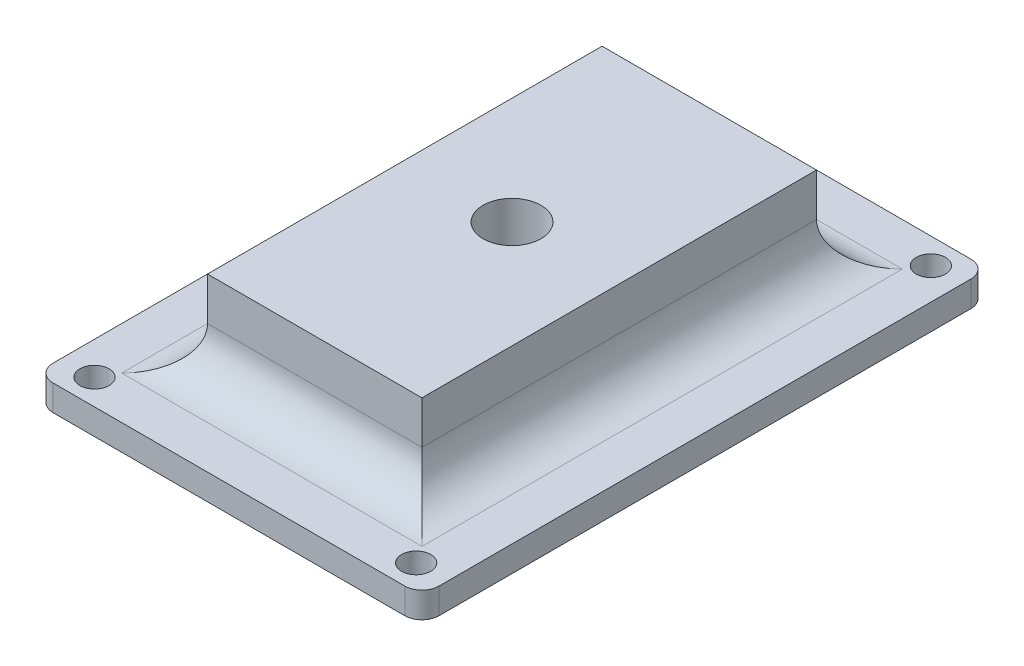
ISO-10303-21;
HEADER;
FILE_DESCRIPTION(('STEP AP214'),'2;1');
FILE_NAME('part.step','',(''),(''),'','','');
FILE_SCHEMA(('AUTOMOTIVE_DESIGN { 1 0 10303 214 1 1 1 1 }'));
ENDSEC;
DATA;
#1=APPLICATION_CONTEXT('core data for automotive mechanical design processes');
#2=APPLICATION_PROTOCOL_DEFINITION('international standard','automotive_design',2000,#1);
#3=PRODUCT_CONTEXT('',#1,'mechanical');
#4=PRODUCT('Part','Part','',(#3));
#5=PRODUCT_RELATED_PRODUCT_CATEGORY('part','',(#4));
#6=PRODUCT_DEFINITION_FORMATION('','',#4);
#7=PRODUCT_DEFINITION_CONTEXT('part definition',#1,'design');
#8=PRODUCT_DEFINITION('design','',#6,#7);
#9=PRODUCT_DEFINITION_SHAPE('','',#8);
#10=(LENGTH_UNIT() NAMED_UNIT(*) SI_UNIT(.MILLI.,.METRE.));
#11=(NAMED_UNIT(*) PLANE_ANGLE_UNIT() SI_UNIT($,.RADIAN.));
#12=(NAMED_UNIT(*) SI_UNIT($,.STERADIAN.) SOLID_ANGLE_UNIT());
#13=UNCERTAINTY_MEASURE_WITH_UNIT(LENGTH_MEASURE(1.E-05),#10,'distance_accuracy_value','');
#14=(GEOMETRIC_REPRESENTATION_CONTEXT(3) GLOBAL_UNCERTAINTY_ASSIGNED_CONTEXT((#13)) GLOBAL_UNIT_ASSIGNED_CONTEXT((#10,
#11,#12)) REPRESENTATION_CONTEXT('',''));
#15=CARTESIAN_POINT('',(0.,0.,0.));
#16=DIRECTION('',(0.,0.,1.));
#17=DIRECTION('',(1.,0.,0.));
#18=AXIS2_PLACEMENT_3D('',#15,#16,#17);
#19=CARTESIAN_POINT('',(0.,98.099999999996,0.));
#20=DIRECTION('',(0.,1.,0.));
#21=DIRECTION('',(0.,0.,1.));
#22=AXIS2_PLACEMENT_3D('',#19,#20,#21);
#23=PLANE('',#22);
#24=CARTESIAN_POINT('',(324.,98.099999999996,30.00000000018));
#25=DIRECTION('',(0.,1.,0.));
#26=DIRECTION('',(0.,0.,1.));
#27=AXIS2_PLACEMENT_3D('',#24,#25,#26);
#28=CIRCLE('',#27,1.69999999999998);
#29=CARTESIAN_POINT('',(324.,98.099999999996,31.70000000018));
#30=VERTEX_POINT('',#29);
#31=EDGE_CURVE('E387',#30,#30,#28,.T.);
#32=ORIENTED_EDGE('',*,*,#31,.F.);
#33=EDGE_LOOP('',(#32));
#34=FACE_BOUND('',#33,.T.);
#35=CARTESIAN_POINT('',(286.5,98.099999999996,30.00000000018));
#36=DIRECTION('',(0.,1.,0.));
#37=DIRECTION('',(0.,0.,1.));
#38=AXIS2_PLACEMENT_3D('',#35,#36,#37);
#39=CIRCLE('',#38,1.69999999999998);
#40=CARTESIAN_POINT('',(286.5,98.099999999996,31.70000000018));
#41=VERTEX_POINT('',#40);
#42=EDGE_CURVE('E389',#41,#41,#39,.T.);
#43=ORIENTED_EDGE('',*,*,#42,.F.);
#44=EDGE_LOOP('',(#43));
#45=FACE_BOUND('',#44,.T.);
#46=CARTESIAN_POINT('',(324.,98.099999999996,-29.99999999982));
#47=DIRECTION('',(0.,1.,0.));
#48=DIRECTION('',(0.,0.,1.));
#49=AXIS2_PLACEMENT_3D('',#46,#47,#48);
#50=CIRCLE('',#49,1.69999999999998);
#51=CARTESIAN_POINT('',(324.,98.099999999996,-28.29999999982));
#52=VERTEX_POINT('',#51);
#53=EDGE_CURVE('E397',#52,#52,#50,.T.);
#54=ORIENTED_EDGE('',*,*,#53,.F.);
#55=EDGE_LOOP('',(#54));
#56=FACE_BOUND('',#55,.T.);
#57=CARTESIAN_POINT('',(286.5,98.099999999996,-29.99999999982));
#58=DIRECTION('',(0.,1.,0.));
#59=DIRECTION('',(0.,0.,1.));
#60=AXIS2_PLACEMENT_3D('',#57,#58,#59);
#61=CIRCLE('',#60,1.69999999999998);
#62=CARTESIAN_POINT('',(286.5,98.099999999996,-28.29999999982));
#63=VERTEX_POINT('',#62);
#64=EDGE_CURVE('E403',#63,#63,#61,.T.);
#65=ORIENTED_EDGE('',*,*,#64,.F.);
#66=EDGE_LOOP('',(#65));
#67=FACE_BOUND('',#66,.T.);
#68=DIRECTION('',(-1.,0.,0.));
#69=VECTOR('',#68,1.);
#70=CARTESIAN_POINT('',(282.67157287516,98.099999999996,-33.));
#71=LINE('',#70,#69);
#72=CARTESIAN_POINT('',(325.67157287516,98.099999999996,-33.));
#73=VERTEX_POINT('',#72);
#74=CARTESIAN_POINT('',(284.67157287516,98.099999999996,-33.));
#75=VERTEX_POINT('',#74);
#76=EDGE_CURVE('E181',#73,#75,#71,.T.);
#77=ORIENTED_EDGE('',*,*,#76,.T.);
#78=CARTESIAN_POINT('',(284.67157287516,98.099999999996,-31.));
#79=DIRECTION('',(0.,1.,0.));
#80=DIRECTION('',(0.,0.,1.));
#81=AXIS2_PLACEMENT_3D('',#78,#79,#80);
#82=CIRCLE('',#81,2.);
#83=CARTESIAN_POINT('',(282.67157287516,98.099999999996,-31.));
#84=VERTEX_POINT('',#83);
#85=EDGE_CURVE('E215',#75,#84,#82,.T.);
#86=ORIENTED_EDGE('',*,*,#85,.T.);
#87=DIRECTION('',(0.,0.,1.));
#88=VECTOR('',#87,1.);
#89=CARTESIAN_POINT('',(282.67157287516,98.099999999996,-33.));
#90=LINE('',#89,#88);
#91=CARTESIAN_POINT('',(282.67157287516,98.099999999996,31.));
#92=VERTEX_POINT('',#91);
#93=EDGE_CURVE('E171',#84,#92,#90,.T.);
#94=ORIENTED_EDGE('',*,*,#93,.T.);
#95=CARTESIAN_POINT('',(284.67157287516,98.099999999996,31.));
#96=DIRECTION('',(0.,1.,0.));
#97=DIRECTION('',(0.,0.,1.));
#98=AXIS2_PLACEMENT_3D('',#95,#96,#97);
#99=CIRCLE('',#98,2.);
#100=CARTESIAN_POINT('',(284.67157287516,98.099999999996,33.));
#101=VERTEX_POINT('',#100);
#102=EDGE_CURVE('E211',#92,#101,#99,.T.);
#103=ORIENTED_EDGE('',*,*,#102,.T.);
#104=DIRECTION('',(1.,0.,0.));
#105=VECTOR('',#104,1.);
#106=CARTESIAN_POINT('',(282.67157287516,98.099999999996,33.));
#107=LINE('',#106,#105);
#108=CARTESIAN_POINT('',(325.67157287516,98.099999999996,33.));
#109=VERTEX_POINT('',#108);
#110=EDGE_CURVE('E174',#101,#109,#107,.T.);
#111=ORIENTED_EDGE('',*,*,#110,.T.);
#112=CARTESIAN_POINT('',(325.67157287516,98.099999999996,31.));
#113=DIRECTION('',(0.,1.,0.));
#114=DIRECTION('',(0.,0.,1.));
#115=AXIS2_PLACEMENT_3D('',#112,#113,#114);
#116=CIRCLE('',#115,2.);
#117=CARTESIAN_POINT('',(327.67157287516,98.099999999996,31.));
#118=VERTEX_POINT('',#117);
#119=EDGE_CURVE('E209',#109,#118,#116,.T.);
#120=ORIENTED_EDGE('',*,*,#119,.T.);
#121=DIRECTION('',(0.,0.,-1.));
#122=VECTOR('',#121,1.);
#123=CARTESIAN_POINT('',(327.67157287516,98.099999999996,-33.));
#124=LINE('',#123,#122);
#125=CARTESIAN_POINT('',(327.67157287516,98.099999999996,-31.));
#126=VERTEX_POINT('',#125);
#127=EDGE_CURVE('E178',#118,#126,#124,.T.);
#128=ORIENTED_EDGE('',*,*,#127,.T.);
#129=CARTESIAN_POINT('',(325.67157287516,98.099999999996,-31.));
#130=DIRECTION('',(0.,1.,0.));
#131=DIRECTION('',(0.,0.,1.));
#132=AXIS2_PLACEMENT_3D('',#129,#130,#131);
#133=CIRCLE('',#132,2.);
#134=EDGE_CURVE('E213',#126,#73,#133,.T.);
#135=ORIENTED_EDGE('',*,*,#134,.T.);
#136=EDGE_LOOP('',(#77,#86,#94,#103,#111,#120,#128,#135));
#137=FACE_BOUND('',#136,.T.);
#138=DIRECTION('',(1.,0.,0.));
#139=VECTOR('',#138,1.);
#140=CARTESIAN_POINT('',(0.,98.099999999996,27.9999999999998));
#141=LINE('',#140,#139);
#142=CARTESIAN_POINT('',(322.67157287516,98.099999999996,28.));
#143=VERTEX_POINT('',#142);
#144=CARTESIAN_POINT('',(287.67157287516,98.099999999996,28.));
#145=VERTEX_POINT('',#144);
#146=EDGE_CURVE('E50',#143,#145,#141,.F.);
#147=ORIENTED_EDGE('',*,*,#146,.T.);
#148=DIRECTION('',(0.,0.,1.));
#149=VECTOR('',#148,1.);
#150=CARTESIAN_POINT('',(287.67157287516,98.099999999996,0.));
#151=LINE('',#150,#149);
#152=CARTESIAN_POINT('',(287.67157287516,98.099999999996,-28.));
#153=VERTEX_POINT('',#152);
#154=EDGE_CURVE('E239',#145,#153,#151,.F.);
#155=ORIENTED_EDGE('',*,*,#154,.T.);
#156=DIRECTION('',(-1.,0.,0.));
#157=VECTOR('',#156,1.);
#158=CARTESIAN_POINT('',(0.,98.099999999996,-28.));
#159=LINE('',#158,#157);
#160=CARTESIAN_POINT('',(322.67157287516,98.099999999996,-28.));
#161=VERTEX_POINT('',#160);
#162=EDGE_CURVE('E58',#153,#161,#159,.F.);
#163=ORIENTED_EDGE('',*,*,#162,.T.);
#164=DIRECTION('',(0.,0.,-1.));
#165=VECTOR('',#164,1.);
#166=CARTESIAN_POINT('',(322.67157287516,98.099999999996,0.));
#167=LINE('',#166,#165);
#168=EDGE_CURVE('E237',#161,#143,#167,.F.);
#169=ORIENTED_EDGE('',*,*,#168,.T.);
#170=EDGE_LOOP('',(#147,#155,#163,#169));
#171=FACE_BOUND('',#170,.T.);
#172=ADVANCED_FACE('F35',(#34,#45,#56,#67,#137,#171),#23,.T.);
#173=CARTESIAN_POINT('',(0.,95.099999999996,0.));
#174=DIRECTION('',(0.,1.,0.));
#175=DIRECTION('',(0.,0.,1.));
#176=AXIS2_PLACEMENT_3D('',#173,#174,#175);
#177=PLANE('',#176);
#178=CARTESIAN_POINT('',(324.,95.099999999996,30.00000000018));
#179=DIRECTION('',(0.,1.,0.));
#180=DIRECTION('',(0.,0.,1.));
#181=AXIS2_PLACEMENT_3D('',#178,#179,#180);
#182=CIRCLE('',#181,1.69999999999998);
#183=CARTESIAN_POINT('',(324.,95.099999999996,31.70000000018));
#184=VERTEX_POINT('',#183);
#185=EDGE_CURVE('E385',#184,#184,#182,.T.);
#186=ORIENTED_EDGE('',*,*,#185,.T.);
#187=EDGE_LOOP('',(#186));
#188=FACE_BOUND('',#187,.T.);
#189=CARTESIAN_POINT('',(286.5,95.099999999996,30.00000000018));
#190=DIRECTION('',(0.,1.,0.));
#191=DIRECTION('',(0.,0.,1.));
#192=AXIS2_PLACEMENT_3D('',#189,#190,#191);
#193=CIRCLE('',#192,1.69999999999998);
#194=CARTESIAN_POINT('',(286.5,95.099999999996,31.70000000018));
#195=VERTEX_POINT('',#194);
#196=EDGE_CURVE('E394',#195,#195,#193,.T.);
#197=ORIENTED_EDGE('',*,*,#196,.T.);
#198=EDGE_LOOP('',(#197));
#199=FACE_BOUND('',#198,.T.);
#200=CARTESIAN_POINT('',(324.,95.099999999996,-29.99999999982));
#201=DIRECTION('',(0.,1.,0.));
#202=DIRECTION('',(0.,0.,1.));
#203=AXIS2_PLACEMENT_3D('',#200,#201,#202);
#204=CIRCLE('',#203,1.69999999999998);
#205=CARTESIAN_POINT('',(324.,95.099999999996,-28.29999999982));
#206=VERTEX_POINT('',#205);
#207=EDGE_CURVE('E400',#206,#206,#204,.T.);
#208=ORIENTED_EDGE('',*,*,#207,.T.);
#209=EDGE_LOOP('',(#208));
#210=FACE_BOUND('',#209,.T.);
#211=CARTESIAN_POINT('',(286.5,95.099999999996,-29.99999999982));
#212=DIRECTION('',(0.,1.,0.));
#213=DIRECTION('',(0.,0.,1.));
#214=AXIS2_PLACEMENT_3D('',#211,#212,#213);
#215=CIRCLE('',#214,1.69999999999998);
#216=CARTESIAN_POINT('',(286.5,95.099999999996,-28.29999999982));
#217=VERTEX_POINT('',#216);
#218=EDGE_CURVE('E406',#217,#217,#215,.T.);
#219=ORIENTED_EDGE('',*,*,#218,.T.);
#220=EDGE_LOOP('',(#219));
#221=FACE_BOUND('',#220,.T.);
#222=CARTESIAN_POINT('',(305.17157287516,95.099999999996,0.));
#223=DIRECTION('',(0.,-1.,0.));
#224=DIRECTION('',(0.,0.,-1.));
#225=AXIS2_PLACEMENT_3D('',#222,#223,#224);
#226=CIRCLE('',#225,6.43890000000003);
#227=CARTESIAN_POINT('',(305.17157287516,95.099999999996,-6.43890000000003));
#228=VERTEX_POINT('',#227);
#229=EDGE_CURVE('E409',#228,#228,#226,.T.);
#230=ORIENTED_EDGE('',*,*,#229,.F.);
#231=EDGE_LOOP('',(#230));
#232=FACE_BOUND('',#231,.T.);
#233=DIRECTION('',(0.,0.,1.));
#234=VECTOR('',#233,1.);
#235=CARTESIAN_POINT('',(282.67157287516,95.099999999996,-33.));
#236=LINE('',#235,#234);
#237=CARTESIAN_POINT('',(282.67157287516,95.099999999996,-31.));
#238=VERTEX_POINT('',#237);
#239=CARTESIAN_POINT('',(282.67157287516,95.099999999996,31.));
#240=VERTEX_POINT('',#239);
#241=EDGE_CURVE('E162',#238,#240,#236,.T.);
#242=ORIENTED_EDGE('',*,*,#241,.F.);
#243=CARTESIAN_POINT('',(284.67157287516,95.099999999996,-31.));
#244=DIRECTION('',(0.,1.,0.));
#245=DIRECTION('',(0.,0.,1.));
#246=AXIS2_PLACEMENT_3D('',#243,#244,#245);
#247=CIRCLE('',#246,2.);
#248=CARTESIAN_POINT('',(284.67157287516,95.099999999996,-33.));
#249=VERTEX_POINT('',#248);
#250=EDGE_CURVE('E202',#238,#249,#247,.F.);
#251=ORIENTED_EDGE('',*,*,#250,.T.);
#252=DIRECTION('',(-1.,0.,0.));
#253=VECTOR('',#252,1.);
#254=CARTESIAN_POINT('',(282.67157287516,95.099999999996,-33.));
#255=LINE('',#254,#253);
#256=CARTESIAN_POINT('',(325.67157287516,95.099999999996,-33.));
#257=VERTEX_POINT('',#256);
#258=EDGE_CURVE('E175',#257,#249,#255,.T.);
#259=ORIENTED_EDGE('',*,*,#258,.F.);
#260=CARTESIAN_POINT('',(325.67157287516,95.099999999996,-31.));
#261=DIRECTION('',(0.,1.,0.));
#262=DIRECTION('',(0.,0.,1.));
#263=AXIS2_PLACEMENT_3D('',#260,#261,#262);
#264=CIRCLE('',#263,2.);
#265=CARTESIAN_POINT('',(327.67157287516,95.099999999996,-31.));
#266=VERTEX_POINT('',#265);
#267=EDGE_CURVE('E200',#257,#266,#264,.F.);
#268=ORIENTED_EDGE('',*,*,#267,.T.);
#269=DIRECTION('',(0.,0.,-1.));
#270=VECTOR('',#269,1.);
#271=CARTESIAN_POINT('',(327.67157287516,95.099999999996,-33.));
#272=LINE('',#271,#270);
#273=CARTESIAN_POINT('',(327.67157287516,95.099999999996,31.));
#274=VERTEX_POINT('',#273);
#275=EDGE_CURVE('E187',#274,#266,#272,.T.);
#276=ORIENTED_EDGE('',*,*,#275,.F.);
#277=CARTESIAN_POINT('',(325.67157287516,95.099999999996,31.));
#278=DIRECTION('',(0.,1.,0.));
#279=DIRECTION('',(0.,0.,1.));
#280=AXIS2_PLACEMENT_3D('',#277,#278,#279);
#281=CIRCLE('',#280,2.);
#282=CARTESIAN_POINT('',(325.67157287516,95.099999999996,33.));
#283=VERTEX_POINT('',#282);
#284=EDGE_CURVE('E196',#274,#283,#281,.F.);
#285=ORIENTED_EDGE('',*,*,#284,.T.);
#286=DIRECTION('',(1.,0.,0.));
#287=VECTOR('',#286,1.);
#288=CARTESIAN_POINT('',(282.67157287516,95.099999999996,33.));
#289=LINE('',#288,#287);
#290=CARTESIAN_POINT('',(284.67157287516,95.099999999996,33.));
#291=VERTEX_POINT('',#290);
#292=EDGE_CURVE('E165',#291,#283,#289,.T.);
#293=ORIENTED_EDGE('',*,*,#292,.F.);
#294=CARTESIAN_POINT('',(284.67157287516,95.099999999996,31.));
#295=DIRECTION('',(0.,1.,0.));
#296=DIRECTION('',(0.,0.,1.));
#297=AXIS2_PLACEMENT_3D('',#294,#295,#296);
#298=CIRCLE('',#297,2.);
#299=EDGE_CURVE('E198',#291,#240,#298,.F.);
#300=ORIENTED_EDGE('',*,*,#299,.T.);
#301=EDGE_LOOP('',(#242,#251,#259,#268,#276,#285,#293,#300));
#302=FACE_BOUND('',#301,.T.);
#303=ADVANCED_FACE('F275',(#188,#199,#210,#221,#232,#302),#177,.F.);
#304=CARTESIAN_POINT('',(282.67157287516,98.099999999996,-33.));
#305=DIRECTION('',(1.,0.,0.));
#306=DIRECTION('',(0.,0.,-1.));
#307=AXIS2_PLACEMENT_3D('',#304,#305,#306);
#308=PLANE('',#307);
#309=ORIENTED_EDGE('',*,*,#93,.F.);
#310=DIRECTION('',(0.,-1.,0.));
#311=VECTOR('',#310,1.);
#312=CARTESIAN_POINT('',(282.67157287516,98.099999999996,-31.));
#313=LINE('',#312,#311);
#314=EDGE_CURVE('E193',#84,#238,#313,.T.);
#315=ORIENTED_EDGE('',*,*,#314,.T.);
#316=ORIENTED_EDGE('',*,*,#241,.T.);
#317=DIRECTION('',(0.,-1.,0.));
#318=VECTOR('',#317,1.);
#319=CARTESIAN_POINT('',(282.67157287516,98.099999999996,31.));
#320=LINE('',#319,#318);
#321=EDGE_CURVE('E183',#240,#92,#320,.F.);
#322=ORIENTED_EDGE('',*,*,#321,.T.);
#323=EDGE_LOOP('',(#309,#315,#316,#322));
#324=FACE_BOUND('',#323,.T.);
#325=ADVANCED_FACE('F281',(#324),#308,.F.);
#326=CARTESIAN_POINT('',(282.67157287516,98.099999999996,33.));
#327=DIRECTION('',(0.,0.,-1.));
#328=DIRECTION('',(-1.,0.,0.));
#329=AXIS2_PLACEMENT_3D('',#326,#327,#328);
#330=PLANE('',#329);
#331=ORIENTED_EDGE('',*,*,#110,.F.);
#332=DIRECTION('',(0.,-1.,0.));
#333=VECTOR('',#332,1.);
#334=CARTESIAN_POINT('',(284.67157287516,98.099999999996,33.));
#335=LINE('',#334,#333);
#336=EDGE_CURVE('E224',#101,#291,#335,.T.);
#337=ORIENTED_EDGE('',*,*,#336,.T.);
#338=ORIENTED_EDGE('',*,*,#292,.T.);
#339=DIRECTION('',(0.,-1.,0.));
#340=VECTOR('',#339,1.);
#341=CARTESIAN_POINT('',(325.67157287516,98.099999999996,33.));
#342=LINE('',#341,#340);
#343=EDGE_CURVE('E222',#283,#109,#342,.F.);
#344=ORIENTED_EDGE('',*,*,#343,.T.);
#345=EDGE_LOOP('',(#331,#337,#338,#344));
#346=FACE_BOUND('',#345,.T.);
#347=ADVANCED_FACE('F297',(#346),#330,.F.);
#348=CARTESIAN_POINT('',(327.67157287516,98.099999999996,-33.));
#349=DIRECTION('',(-1.,0.,0.));
#350=DIRECTION('',(0.,0.,1.));
#351=AXIS2_PLACEMENT_3D('',#348,#349,#350);
#352=PLANE('',#351);
#353=ORIENTED_EDGE('',*,*,#275,.T.);
#354=DIRECTION('',(0.,-1.,0.));
#355=VECTOR('',#354,1.);
#356=CARTESIAN_POINT('',(327.67157287516,98.099999999996,-31.));
#357=LINE('',#356,#355);
#358=EDGE_CURVE('E220',#266,#126,#357,.F.);
#359=ORIENTED_EDGE('',*,*,#358,.T.);
#360=ORIENTED_EDGE('',*,*,#127,.F.);
#361=DIRECTION('',(0.,-1.,0.));
#362=VECTOR('',#361,1.);
#363=CARTESIAN_POINT('',(327.67157287516,98.099999999996,31.));
#364=LINE('',#363,#362);
#365=EDGE_CURVE('E217',#118,#274,#364,.T.);
#366=ORIENTED_EDGE('',*,*,#365,.T.);
#367=EDGE_LOOP('',(#353,#359,#360,#366));
#368=FACE_BOUND('',#367,.T.);
#369=ADVANCED_FACE('F293',(#368),#352,.F.);
#370=CARTESIAN_POINT('',(282.67157287516,98.099999999996,-33.));
#371=DIRECTION('',(0.,0.,1.));
#372=DIRECTION('',(1.,0.,0.));
#373=AXIS2_PLACEMENT_3D('',#370,#371,#372);
#374=PLANE('',#373);
#375=ORIENTED_EDGE('',*,*,#258,.T.);
#376=DIRECTION('',(0.,-1.,0.));
#377=VECTOR('',#376,1.);
#378=CARTESIAN_POINT('',(284.67157287516,98.099999999996,-33.));
#379=LINE('',#378,#377);
#380=EDGE_CURVE('E207',#249,#75,#379,.F.);
#381=ORIENTED_EDGE('',*,*,#380,.T.);
#382=ORIENTED_EDGE('',*,*,#76,.F.);
#383=DIRECTION('',(0.,-1.,0.));
#384=VECTOR('',#383,1.);
#385=CARTESIAN_POINT('',(325.67157287516,98.099999999996,-33.));
#386=LINE('',#385,#384);
#387=EDGE_CURVE('E204',#73,#257,#386,.T.);
#388=ORIENTED_EDGE('',*,*,#387,.T.);
#389=EDGE_LOOP('',(#375,#381,#382,#388));
#390=FACE_BOUND('',#389,.T.);
#391=ADVANCED_FACE('F289',(#390),#374,.F.);
#392=CARTESIAN_POINT('',(284.67157287516,98.099999999996,-31.));
#393=DIRECTION('',(0.,-1.,0.));
#394=DIRECTION('',(0.,0.,-1.));
#395=AXIS2_PLACEMENT_3D('',#392,#393,#394);
#396=CYLINDRICAL_SURFACE('',#395,2.);
#397=ORIENTED_EDGE('',*,*,#85,.F.);
#398=ORIENTED_EDGE('',*,*,#380,.F.);
#399=ORIENTED_EDGE('',*,*,#250,.F.);
#400=ORIENTED_EDGE('',*,*,#314,.F.);
#401=EDGE_LOOP('',(#397,#398,#399,#400));
#402=FACE_BOUND('',#401,.T.);
#403=ADVANCED_FACE('F292',(#402),#396,.T.);
#404=CARTESIAN_POINT('',(325.67157287516,98.099999999996,-31.));
#405=DIRECTION('',(0.,-1.,0.));
#406=DIRECTION('',(0.,0.,-1.));
#407=AXIS2_PLACEMENT_3D('',#404,#405,#406);
#408=CYLINDRICAL_SURFACE('',#407,2.);
#409=ORIENTED_EDGE('',*,*,#134,.F.);
#410=ORIENTED_EDGE('',*,*,#358,.F.);
#411=ORIENTED_EDGE('',*,*,#267,.F.);
#412=ORIENTED_EDGE('',*,*,#387,.F.);
#413=EDGE_LOOP('',(#409,#410,#411,#412));
#414=FACE_BOUND('',#413,.T.);
#415=ADVANCED_FACE('F307',(#414),#408,.T.);
#416=CARTESIAN_POINT('',(284.67157287516,98.099999999996,31.));
#417=DIRECTION('',(0.,-1.,0.));
#418=DIRECTION('',(0.,0.,-1.));
#419=AXIS2_PLACEMENT_3D('',#416,#417,#418);
#420=CYLINDRICAL_SURFACE('',#419,2.);
#421=ORIENTED_EDGE('',*,*,#102,.F.);
#422=ORIENTED_EDGE('',*,*,#321,.F.);
#423=ORIENTED_EDGE('',*,*,#299,.F.);
#424=ORIENTED_EDGE('',*,*,#336,.F.);
#425=EDGE_LOOP('',(#421,#422,#423,#424));
#426=FACE_BOUND('',#425,.T.);
#427=ADVANCED_FACE('F311',(#426),#420,.T.);
#428=CARTESIAN_POINT('',(325.67157287516,98.099999999996,31.));
#429=DIRECTION('',(0.,-1.,0.));
#430=DIRECTION('',(0.,0.,-1.));
#431=AXIS2_PLACEMENT_3D('',#428,#429,#430);
#432=CYLINDRICAL_SURFACE('',#431,2.);
#433=ORIENTED_EDGE('',*,*,#119,.F.);
#434=ORIENTED_EDGE('',*,*,#343,.F.);
#435=ORIENTED_EDGE('',*,*,#284,.F.);
#436=ORIENTED_EDGE('',*,*,#365,.F.);
#437=EDGE_LOOP('',(#433,#434,#435,#436));
#438=FACE_BOUND('',#437,.T.);
#439=ADVANCED_FACE('F315',(#438),#432,.T.);
#440=CARTESIAN_POINT('',(317.67157287516,108.099999999996,23.));
#441=DIRECTION('',(-1.,0.,0.));
#442=DIRECTION('',(0.,0.,1.));
#443=AXIS2_PLACEMENT_3D('',#440,#441,#442);
#444=PLANE('',#443);
#445=DIRECTION('',(0.,-1.,0.));
#446=VECTOR('',#445,1.);
#447=CARTESIAN_POINT('',(317.67157287516,108.099999999996,23.));
#448=LINE('',#447,#446);
#449=CARTESIAN_POINT('',(317.67157287516,108.099999999996,23.));
#450=VERTEX_POINT('',#449);
#451=CARTESIAN_POINT('',(317.67157287516,103.099999999996,23.));
#452=VERTEX_POINT('',#451);
#453=EDGE_CURVE('E259',#450,#452,#448,.T.);
#454=ORIENTED_EDGE('',*,*,#453,.T.);
#455=DIRECTION('',(0.,0.,-1.));
#456=VECTOR('',#455,1.);
#457=CARTESIAN_POINT('',(317.67157287516,103.099999999996,23.));
#458=LINE('',#457,#456);
#459=CARTESIAN_POINT('',(317.67157287516,103.099999999996,-23.));
#460=VERTEX_POINT('',#459);
#461=EDGE_CURVE('E161',#452,#460,#458,.T.);
#462=ORIENTED_EDGE('',*,*,#461,.T.);
#463=DIRECTION('',(0.,-1.,0.));
#464=VECTOR('',#463,1.);
#465=CARTESIAN_POINT('',(317.67157287516,108.099999999996,-23.));
#466=LINE('',#465,#464);
#467=CARTESIAN_POINT('',(317.67157287516,108.099999999996,-23.));
#468=VERTEX_POINT('',#467);
#469=EDGE_CURVE('E140',#468,#460,#466,.T.);
#470=ORIENTED_EDGE('',*,*,#469,.F.);
#471=DIRECTION('',(0.,0.,-1.));
#472=VECTOR('',#471,1.);
#473=CARTESIAN_POINT('',(317.67157287516,108.099999999996,23.));
#474=LINE('',#473,#472);
#475=EDGE_CURVE('E147',#450,#468,#474,.T.);
#476=ORIENTED_EDGE('',*,*,#475,.F.);
#477=EDGE_LOOP('',(#454,#462,#470,#476));
#478=FACE_BOUND('',#477,.T.);
#479=ADVANCED_FACE('F159',(#478),#444,.F.);
#480=CARTESIAN_POINT('',(317.67157287516,108.099999999996,-23.));
#481=DIRECTION('',(0.,0.,1.));
#482=DIRECTION('',(1.,0.,0.));
#483=AXIS2_PLACEMENT_3D('',#480,#481,#482);
#484=PLANE('',#483);
#485=ORIENTED_EDGE('',*,*,#469,.T.);
#486=DIRECTION('',(-1.,0.,0.));
#487=VECTOR('',#486,1.);
#488=CARTESIAN_POINT('',(317.67157287516,103.099999999996,-23.));
#489=LINE('',#488,#487);
#490=CARTESIAN_POINT('',(292.67157287516,103.099999999996,-23.));
#491=VERTEX_POINT('',#490);
#492=EDGE_CURVE('E227',#460,#491,#489,.T.);
#493=ORIENTED_EDGE('',*,*,#492,.T.);
#494=DIRECTION('',(0.,-1.,0.));
#495=VECTOR('',#494,1.);
#496=CARTESIAN_POINT('',(292.67157287516,108.099999999996,-23.));
#497=LINE('',#496,#495);
#498=CARTESIAN_POINT('',(292.67157287516,108.099999999996,-23.));
#499=VERTEX_POINT('',#498);
#500=EDGE_CURVE('E143',#499,#491,#497,.T.);
#501=ORIENTED_EDGE('',*,*,#500,.F.);
#502=DIRECTION('',(-1.,0.,0.));
#503=VECTOR('',#502,1.);
#504=CARTESIAN_POINT('',(317.67157287516,108.099999999996,-23.));
#505=LINE('',#504,#503);
#506=EDGE_CURVE('E135',#468,#499,#505,.T.);
#507=ORIENTED_EDGE('',*,*,#506,.F.);
#508=EDGE_LOOP('',(#485,#493,#501,#507));
#509=FACE_BOUND('',#508,.T.);
#510=ADVANCED_FACE('F137',(#509),#484,.F.);
#511=CARTESIAN_POINT('',(292.67157287516,108.099999999996,-23.));
#512=DIRECTION('',(1.,0.,0.));
#513=DIRECTION('',(0.,0.,-1.));
#514=AXIS2_PLACEMENT_3D('',#511,#512,#513);
#515=PLANE('',#514);
#516=ORIENTED_EDGE('',*,*,#500,.T.);
#517=DIRECTION('',(0.,0.,1.));
#518=VECTOR('',#517,1.);
#519=CARTESIAN_POINT('',(292.67157287516,103.099999999996,-23.));
#520=LINE('',#519,#518);
#521=CARTESIAN_POINT('',(292.67157287516,103.099999999996,23.));
#522=VERTEX_POINT('',#521);
#523=EDGE_CURVE('E234',#491,#522,#520,.T.);
#524=ORIENTED_EDGE('',*,*,#523,.T.);
#525=DIRECTION('',(0.,-1.,0.));
#526=VECTOR('',#525,1.);
#527=CARTESIAN_POINT('',(292.67157287516,108.099999999996,23.));
#528=LINE('',#527,#526);
#529=CARTESIAN_POINT('',(292.67157287516,108.099999999996,23.));
#530=VERTEX_POINT('',#529);
#531=EDGE_CURVE('E167',#530,#522,#528,.T.);
#532=ORIENTED_EDGE('',*,*,#531,.F.);
#533=DIRECTION('',(0.,0.,1.));
#534=VECTOR('',#533,1.);
#535=CARTESIAN_POINT('',(292.67157287516,108.099999999996,-23.));
#536=LINE('',#535,#534);
#537=EDGE_CURVE('E146',#499,#530,#536,.T.);
#538=ORIENTED_EDGE('',*,*,#537,.F.);
#539=EDGE_LOOP('',(#516,#524,#532,#538));
#540=FACE_BOUND('',#539,.T.);
#541=ADVANCED_FACE('F255',(#540),#515,.F.);
#542=CARTESIAN_POINT('',(292.67157287516,108.099999999996,23.));
#543=DIRECTION('',(0.,0.,-1.));
#544=DIRECTION('',(-1.,0.,0.));
#545=AXIS2_PLACEMENT_3D('',#542,#543,#544);
#546=PLANE('',#545);
#547=ORIENTED_EDGE('',*,*,#531,.T.);
#548=DIRECTION('',(1.,0.,0.));
#549=VECTOR('',#548,1.);
#550=CARTESIAN_POINT('',(292.67157287516,103.099999999996,23.));
#551=LINE('',#550,#549);
#552=EDGE_CURVE('E231',#522,#452,#551,.T.);
#553=ORIENTED_EDGE('',*,*,#552,.T.);
#554=ORIENTED_EDGE('',*,*,#453,.F.);
#555=DIRECTION('',(1.,0.,0.));
#556=VECTOR('',#555,1.);
#557=CARTESIAN_POINT('',(292.67157287516,108.099999999996,23.));
#558=LINE('',#557,#556);
#559=EDGE_CURVE('E152',#530,#450,#558,.T.);
#560=ORIENTED_EDGE('',*,*,#559,.F.);
#561=EDGE_LOOP('',(#547,#553,#554,#560));
#562=FACE_BOUND('',#561,.T.);
#563=ADVANCED_FACE('F264',(#562),#546,.F.);
#564=CARTESIAN_POINT('',(0.,108.099999999996,0.));
#565=DIRECTION('',(0.,1.,0.));
#566=DIRECTION('',(0.,0.,1.));
#567=AXIS2_PLACEMENT_3D('',#564,#565,#566);
#568=PLANE('',#567);
#569=CARTESIAN_POINT('',(305.17157287516,108.099999999996,0.));
#570=DIRECTION('',(0.,-1.,0.));
#571=DIRECTION('',(0.,0.,-1.));
#572=AXIS2_PLACEMENT_3D('',#569,#570,#571);
#573=CIRCLE('',#572,3.3782);
#574=CARTESIAN_POINT('',(305.17157287516,108.099999999996,-3.3782));
#575=VERTEX_POINT('',#574);
#576=EDGE_CURVE('E156',#575,#575,#573,.T.);
#577=ORIENTED_EDGE('',*,*,#576,.T.);
#578=EDGE_LOOP('',(#577));
#579=FACE_BOUND('',#578,.T.);
#580=ORIENTED_EDGE('',*,*,#475,.T.);
#581=ORIENTED_EDGE('',*,*,#506,.T.);
#582=ORIENTED_EDGE('',*,*,#537,.T.);
#583=ORIENTED_EDGE('',*,*,#559,.T.);
#584=EDGE_LOOP('',(#580,#581,#582,#583));
#585=FACE_BOUND('',#584,.T.);
#586=ADVANCED_FACE('F150',(#579,#585),#568,.T.);
#587=CARTESIAN_POINT('',(317.67157287516,103.099999999996,-28.));
#588=DIRECTION('',(-1.,0.,0.));
#589=DIRECTION('',(0.,0.,1.));
#590=AXIS2_PLACEMENT_3D('',#587,#588,#589);
#591=CYLINDRICAL_SURFACE('',#590,5.);
#592=ORIENTED_EDGE('',*,*,#492,.F.);
#593=CARTESIAN_POINT('',(322.67157287516,103.099999999996,-28.));
#594=DIRECTION('',(-0.707106781186547,0.,-0.707106781186547));
#595=DIRECTION('',(-0.707106781186547,0.,0.707106781186547));
#596=AXIS2_PLACEMENT_3D('',#593,#594,#595);
#597=ELLIPSE('',#596,7.07106781186547,5.);
#598=EDGE_CURVE('E43',#460,#161,#597,.F.);
#599=ORIENTED_EDGE('',*,*,#598,.T.);
#600=ORIENTED_EDGE('',*,*,#162,.F.);
#601=CARTESIAN_POINT('',(287.67157287516,103.099999999996,-28.));
#602=DIRECTION('',(-0.707106781186547,0.,0.707106781186547));
#603=DIRECTION('',(-0.707106781186547,0.,-0.707106781186547));
#604=AXIS2_PLACEMENT_3D('',#601,#602,#603);
#605=ELLIPSE('',#604,7.07106781186547,5.);
#606=EDGE_CURVE('E244',#153,#491,#605,.T.);
#607=ORIENTED_EDGE('',*,*,#606,.T.);
#608=EDGE_LOOP('',(#592,#599,#600,#607));
#609=FACE_BOUND('',#608,.T.);
#610=ADVANCED_FACE('F246',(#609),#591,.F.);
#611=CARTESIAN_POINT('',(292.67157287516,103.099999999996,28.));
#612=DIRECTION('',(1.,0.,0.));
#613=DIRECTION('',(0.,0.,-1.));
#614=AXIS2_PLACEMENT_3D('',#611,#612,#613);
#615=CYLINDRICAL_SURFACE('',#614,5.);
#616=ORIENTED_EDGE('',*,*,#552,.F.);
#617=CARTESIAN_POINT('',(287.67157287516,103.099999999996,28.));
#618=DIRECTION('',(0.707106781186547,0.,0.707106781186548));
#619=DIRECTION('',(0.707106781186548,0.,-0.707106781186547));
#620=AXIS2_PLACEMENT_3D('',#617,#618,#619);
#621=ELLIPSE('',#620,7.07106781186547,5.);
#622=EDGE_CURVE('E242',#522,#145,#621,.F.);
#623=ORIENTED_EDGE('',*,*,#622,.T.);
#624=ORIENTED_EDGE('',*,*,#146,.F.);
#625=CARTESIAN_POINT('',(322.67157287516,103.099999999996,28.));
#626=DIRECTION('',(0.707106781186548,0.,-0.707106781186547));
#627=DIRECTION('',(0.707106781186547,0.,0.707106781186548));
#628=AXIS2_PLACEMENT_3D('',#625,#626,#627);
#629=ELLIPSE('',#628,7.07106781186548,5.);
#630=EDGE_CURVE('E11',#143,#452,#629,.T.);
#631=ORIENTED_EDGE('',*,*,#630,.T.);
#632=EDGE_LOOP('',(#616,#623,#624,#631));
#633=FACE_BOUND('',#632,.T.);
#634=ADVANCED_FACE('F266',(#633),#615,.F.);
#635=CARTESIAN_POINT('',(287.67157287516,103.099999999996,-23.));
#636=DIRECTION('',(0.,0.,1.));
#637=DIRECTION('',(1.,0.,0.));
#638=AXIS2_PLACEMENT_3D('',#635,#636,#637);
#639=CYLINDRICAL_SURFACE('',#638,5.);
#640=ORIENTED_EDGE('',*,*,#606,.F.);
#641=ORIENTED_EDGE('',*,*,#154,.F.);
#642=ORIENTED_EDGE('',*,*,#622,.F.);
#643=ORIENTED_EDGE('',*,*,#523,.F.);
#644=EDGE_LOOP('',(#640,#641,#642,#643));
#645=FACE_BOUND('',#644,.T.);
#646=ADVANCED_FACE('F253',(#645),#639,.F.);
#647=CARTESIAN_POINT('',(322.67157287516,103.099999999996,23.));
#648=DIRECTION('',(0.,0.,-1.));
#649=DIRECTION('',(-1.,0.,0.));
#650=AXIS2_PLACEMENT_3D('',#647,#648,#649);
#651=CYLINDRICAL_SURFACE('',#650,5.);
#652=ORIENTED_EDGE('',*,*,#630,.F.);
#653=ORIENTED_EDGE('',*,*,#168,.F.);
#654=ORIENTED_EDGE('',*,*,#598,.F.);
#655=ORIENTED_EDGE('',*,*,#461,.F.);
#656=EDGE_LOOP('',(#652,#653,#654,#655));
#657=FACE_BOUND('',#656,.T.);
#658=ADVANCED_FACE('F37',(#657),#651,.F.);
#659=CARTESIAN_POINT('',(305.17157287516,95.099999999996,0.));
#660=DIRECTION('',(0.,-1.,0.));
#661=DIRECTION('',(0.,0.,-1.));
#662=AXIS2_PLACEMENT_3D('',#659,#660,#661);
#663=CYLINDRICAL_SURFACE('',#662,3.3782);
#664=ORIENTED_EDGE('',*,*,#576,.F.);
#665=EDGE_LOOP('',(#664));
#666=FACE_BOUND('',#665,.T.);
#667=CARTESIAN_POINT('',(305.17157287516,98.6209325839773,0.));
#668=DIRECTION('',(0.,-1.,0.));
#669=DIRECTION('',(0.,0.,-1.));
#670=AXIS2_PLACEMENT_3D('',#667,#668,#669);
#671=CIRCLE('',#670,3.3782);
#672=CARTESIAN_POINT('',(305.17157287516,98.6209325839773,-3.3782));
#673=VERTEX_POINT('',#672);
#674=EDGE_CURVE('E412',#673,#673,#671,.T.);
#675=ORIENTED_EDGE('',*,*,#674,.T.);
#676=EDGE_LOOP('',(#675));
#677=FACE_BOUND('',#676,.T.);
#678=ADVANCED_FACE('F357',(#666,#677),#663,.F.);
#679=CARTESIAN_POINT('',(305.17157287516,95.099999999996,0.));
#680=DIRECTION('',(0.,-1.,0.));
#681=DIRECTION('',(0.,0.,-1.));
#682=AXIS2_PLACEMENT_3D('',#679,#680,#681);
#683=CONICAL_SURFACE('',#682,6.43890000000003,0.71558499331768);
#684=ORIENTED_EDGE('',*,*,#674,.F.);
#685=EDGE_LOOP('',(#684));
#686=FACE_BOUND('',#685,.T.);
#687=ORIENTED_EDGE('',*,*,#229,.T.);
#688=EDGE_LOOP('',(#687));
#689=FACE_BOUND('',#688,.T.);
#690=ADVANCED_FACE('F360',(#686,#689),#683,.F.);
#691=CARTESIAN_POINT('',(286.5,98.099999999996,-29.99999999982));
#692=DIRECTION('',(0.,1.,0.));
#693=DIRECTION('',(0.,0.,1.));
#694=AXIS2_PLACEMENT_3D('',#691,#692,#693);
#695=CYLINDRICAL_SURFACE('',#694,1.69999999999998);
#696=ORIENTED_EDGE('',*,*,#218,.F.);
#697=EDGE_LOOP('',(#696));
#698=FACE_BOUND('',#697,.T.);
#699=ORIENTED_EDGE('',*,*,#64,.T.);
#700=EDGE_LOOP('',(#699));
#701=FACE_BOUND('',#700,.T.);
#702=ADVANCED_FACE('F364',(#698,#701),#695,.F.);
#703=CARTESIAN_POINT('',(324.,98.099999999996,-29.99999999982));
#704=DIRECTION('',(0.,1.,0.));
#705=DIRECTION('',(0.,0.,1.));
#706=AXIS2_PLACEMENT_3D('',#703,#704,#705);
#707=CYLINDRICAL_SURFACE('',#706,1.69999999999998);
#708=ORIENTED_EDGE('',*,*,#207,.F.);
#709=EDGE_LOOP('',(#708));
#710=FACE_BOUND('',#709,.T.);
#711=ORIENTED_EDGE('',*,*,#53,.T.);
#712=EDGE_LOOP('',(#711));
#713=FACE_BOUND('',#712,.T.);
#714=ADVANCED_FACE('F368',(#710,#713),#707,.F.);
#715=CARTESIAN_POINT('',(286.5,98.099999999996,30.00000000018));
#716=DIRECTION('',(0.,1.,0.));
#717=DIRECTION('',(0.,0.,1.));
#718=AXIS2_PLACEMENT_3D('',#715,#716,#717);
#719=CYLINDRICAL_SURFACE('',#718,1.69999999999998);
#720=ORIENTED_EDGE('',*,*,#196,.F.);
#721=EDGE_LOOP('',(#720));
#722=FACE_BOUND('',#721,.T.);
#723=ORIENTED_EDGE('',*,*,#42,.T.);
#724=EDGE_LOOP('',(#723));
#725=FACE_BOUND('',#724,.T.);
#726=ADVANCED_FACE('F372',(#722,#725),#719,.F.);
#727=CARTESIAN_POINT('',(324.,98.099999999996,30.00000000018));
#728=DIRECTION('',(0.,1.,0.));
#729=DIRECTION('',(0.,0.,1.));
#730=AXIS2_PLACEMENT_3D('',#727,#728,#729);
#731=CYLINDRICAL_SURFACE('',#730,1.69999999999998);
#732=ORIENTED_EDGE('',*,*,#185,.F.);
#733=EDGE_LOOP('',(#732));
#734=FACE_BOUND('',#733,.T.);
#735=ORIENTED_EDGE('',*,*,#31,.T.);
#736=EDGE_LOOP('',(#735));
#737=FACE_BOUND('',#736,.T.);
#738=ADVANCED_FACE('F376',(#734,#737),#731,.F.);
#739=CLOSED_SHELL('',(#172,#303,#325,#347,#369,#391,#403,#415,#427,#439,#479,#510,#541,#563,
#586,#610,#634,#646,#658,#678,#690,#702,#714,#726,#738));
#740=MANIFOLD_SOLID_BREP('B2',#739);
#741=ADVANCED_BREP_SHAPE_REPRESENTATION('',(#18,#740),#14);
#742=SHAPE_DEFINITION_REPRESENTATION(#9,#741);
ENDSEC;
END-ISO-10303-21;
